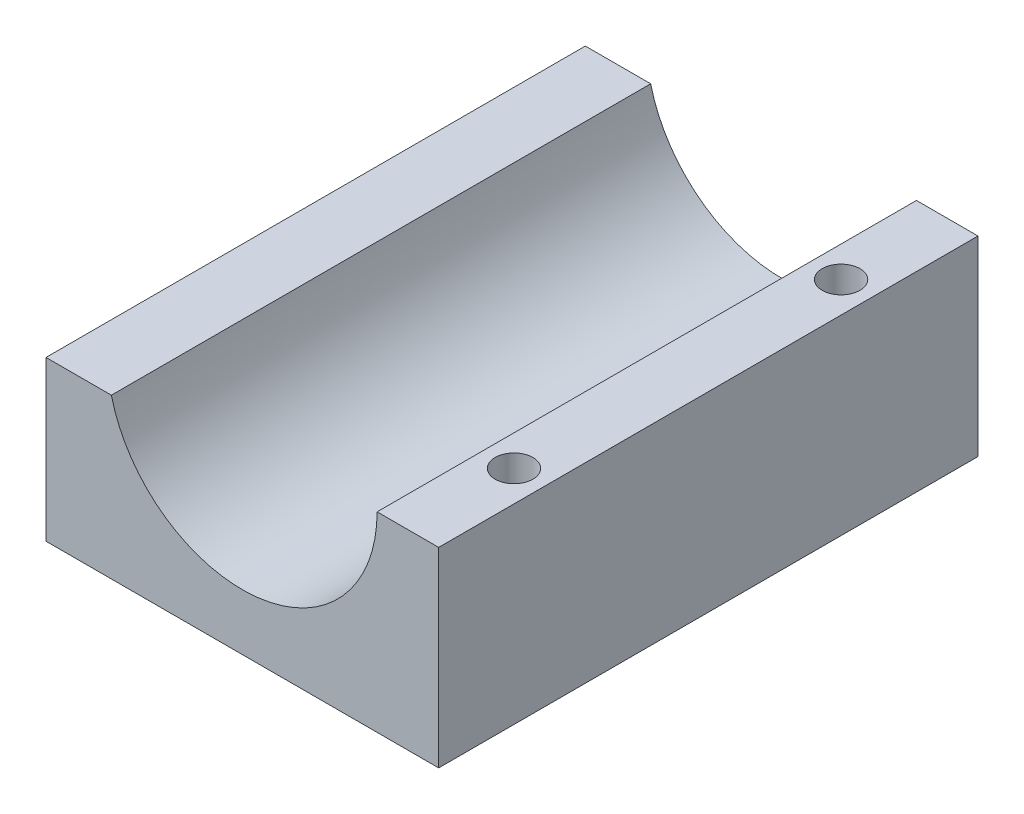
ISO-10303-21;
HEADER;
FILE_DESCRIPTION(('STEP AP214'),'2;1');
FILE_NAME('part.step','',(''),(''),'','','');
FILE_SCHEMA(('AUTOMOTIVE_DESIGN { 1 0 10303 214 1 1 1 1 }'));
ENDSEC;
DATA;
#1=APPLICATION_CONTEXT('core data for automotive mechanical design processes');
#2=APPLICATION_PROTOCOL_DEFINITION('international standard','automotive_design',2000,#1);
#3=PRODUCT_CONTEXT('',#1,'mechanical');
#4=PRODUCT('Part','Part','',(#3));
#5=PRODUCT_RELATED_PRODUCT_CATEGORY('part','',(#4));
#6=PRODUCT_DEFINITION_FORMATION('','',#4);
#7=PRODUCT_DEFINITION_CONTEXT('part definition',#1,'design');
#8=PRODUCT_DEFINITION('design','',#6,#7);
#9=PRODUCT_DEFINITION_SHAPE('','',#8);
#10=(LENGTH_UNIT() NAMED_UNIT(*) SI_UNIT(.MILLI.,.METRE.));
#11=(NAMED_UNIT(*) PLANE_ANGLE_UNIT() SI_UNIT($,.RADIAN.));
#12=(NAMED_UNIT(*) SI_UNIT($,.STERADIAN.) SOLID_ANGLE_UNIT());
#13=UNCERTAINTY_MEASURE_WITH_UNIT(LENGTH_MEASURE(1.E-05),#10,'distance_accuracy_value','');
#14=(GEOMETRIC_REPRESENTATION_CONTEXT(3) GLOBAL_UNCERTAINTY_ASSIGNED_CONTEXT((#13)) GLOBAL_UNIT_ASSIGNED_CONTEXT((#10,
#11,#12)) REPRESENTATION_CONTEXT('',''));
#15=CARTESIAN_POINT('',(0.,0.,0.));
#16=DIRECTION('',(0.,0.,1.));
#17=DIRECTION('',(1.,0.,0.));
#18=AXIS2_PLACEMENT_3D('',#15,#16,#17);
#19=CARTESIAN_POINT('',(0.,9.,0.));
#20=DIRECTION('',(1.,0.,0.));
#21=DIRECTION('',(0.,0.,-1.));
#22=AXIS2_PLACEMENT_3D('',#19,#20,#21);
#23=PLANE('',#22);
#24=DIRECTION('',(0.,0.,1.));
#25=VECTOR('',#24,1.);
#26=CARTESIAN_POINT('',(0.,7.5,-66.2778912014065));
#27=LINE('',#26,#25);
#28=CARTESIAN_POINT('',(0.,7.5,-25.41));
#29=VERTEX_POINT('',#28);
#30=CARTESIAN_POINT('',(0.,7.5,0.));
#31=VERTEX_POINT('',#30);
#32=EDGE_CURVE('E90',#29,#31,#27,.T.);
#33=ORIENTED_EDGE('',*,*,#32,.F.);
#34=DIRECTION('',(0.,-1.,0.));
#35=VECTOR('',#34,1.);
#36=CARTESIAN_POINT('',(0.,9.,-25.41));
#37=LINE('',#36,#35);
#38=CARTESIAN_POINT('',(0.,0.,-25.41));
#39=VERTEX_POINT('',#38);
#40=EDGE_CURVE('E84',#29,#39,#37,.T.);
#41=ORIENTED_EDGE('',*,*,#40,.T.);
#42=DIRECTION('',(0.,0.,1.));
#43=VECTOR('',#42,1.);
#44=CARTESIAN_POINT('',(0.,0.,0.));
#45=LINE('',#44,#43);
#46=CARTESIAN_POINT('',(0.,0.,0.));
#47=VERTEX_POINT('',#46);
#48=EDGE_CURVE('E88',#39,#47,#45,.T.);
#49=ORIENTED_EDGE('',*,*,#48,.T.);
#50=DIRECTION('',(0.,-1.,0.));
#51=VECTOR('',#50,1.);
#52=CARTESIAN_POINT('',(0.,9.,0.));
#53=LINE('',#52,#51);
#54=EDGE_CURVE('E49',#31,#47,#53,.T.);
#55=ORIENTED_EDGE('',*,*,#54,.F.);
#56=EDGE_LOOP('',(#33,#41,#49,#55));
#57=FACE_BOUND('',#56,.T.);
#58=ADVANCED_FACE('F42',(#57),#23,.F.);
#59=CARTESIAN_POINT('',(0.,9.,-25.41));
#60=DIRECTION('',(0.,0.,1.));
#61=DIRECTION('',(1.,0.,0.));
#62=AXIS2_PLACEMENT_3D('',#59,#60,#61);
#63=PLANE('',#62);
#64=DIRECTION('',(-1.,0.,0.));
#65=VECTOR('',#64,1.);
#66=CARTESIAN_POINT('',(0.,7.5,-25.41));
#67=LINE('',#66,#65);
#68=CARTESIAN_POINT('',(3.07970827269893,7.5,-25.41));
#69=VERTEX_POINT('',#68);
#70=EDGE_CURVE('E184',#69,#29,#67,.T.);
#71=ORIENTED_EDGE('',*,*,#70,.F.);
#72=CARTESIAN_POINT('',(9.25,9.,-25.41));
#73=DIRECTION('',(0.,0.,1.));
#74=DIRECTION('',(1.,0.,0.));
#75=AXIS2_PLACEMENT_3D('',#72,#73,#74);
#76=CIRCLE('',#75,6.35);
#77=CARTESIAN_POINT('',(15.6,9.,-25.41));
#78=VERTEX_POINT('',#77);
#79=EDGE_CURVE('E113',#69,#78,#76,.T.);
#80=ORIENTED_EDGE('',*,*,#79,.T.);
#81=DIRECTION('',(-1.,0.,0.));
#82=VECTOR('',#81,1.);
#83=CARTESIAN_POINT('',(0.,9.,-25.41));
#84=LINE('',#83,#82);
#85=CARTESIAN_POINT('',(18.5,9.,-25.41));
#86=VERTEX_POINT('',#85);
#87=EDGE_CURVE('E94',#86,#78,#84,.T.);
#88=ORIENTED_EDGE('',*,*,#87,.F.);
#89=DIRECTION('',(0.,-1.,0.));
#90=VECTOR('',#89,1.);
#91=CARTESIAN_POINT('',(18.5,9.,-25.41));
#92=LINE('',#91,#90);
#93=CARTESIAN_POINT('',(18.5,0.,-25.41));
#94=VERTEX_POINT('',#93);
#95=EDGE_CURVE('E93',#86,#94,#92,.T.);
#96=ORIENTED_EDGE('',*,*,#95,.T.);
#97=DIRECTION('',(-1.,0.,0.));
#98=VECTOR('',#97,1.);
#99=CARTESIAN_POINT('',(0.,0.,-25.41));
#100=LINE('',#99,#98);
#101=EDGE_CURVE('E98',#94,#39,#100,.T.);
#102=ORIENTED_EDGE('',*,*,#101,.T.);
#103=ORIENTED_EDGE('',*,*,#40,.F.);
#104=EDGE_LOOP('',(#71,#80,#88,#96,#102,#103));
#105=FACE_BOUND('',#104,.T.);
#106=ADVANCED_FACE('F99',(#105),#63,.F.);
#107=CARTESIAN_POINT('',(0.,9.,0.));
#108=DIRECTION('',(0.,-1.,0.));
#109=DIRECTION('',(0.,0.,-1.));
#110=AXIS2_PLACEMENT_3D('',#107,#108,#109);
#111=PLANE('',#110);
#112=CARTESIAN_POINT('',(17.05,9.,-20.41));
#113=DIRECTION('',(0.,1.,0.));
#114=DIRECTION('',(0.,0.,1.));
#115=AXIS2_PLACEMENT_3D('',#112,#113,#114);
#116=CIRCLE('',#115,0.88899999999999);
#117=CARTESIAN_POINT('',(17.05,9.,-19.521));
#118=VERTEX_POINT('',#117);
#119=EDGE_CURVE('E180',#118,#118,#116,.T.);
#120=ORIENTED_EDGE('',*,*,#119,.F.);
#121=EDGE_LOOP('',(#120));
#122=FACE_BOUND('',#121,.T.);
#123=CARTESIAN_POINT('',(17.05,9.,-5.));
#124=DIRECTION('',(0.,1.,0.));
#125=DIRECTION('',(0.,0.,1.));
#126=AXIS2_PLACEMENT_3D('',#123,#124,#125);
#127=CIRCLE('',#126,0.88899999999999);
#128=CARTESIAN_POINT('',(17.05,9.,-4.11100000000001));
#129=VERTEX_POINT('',#128);
#130=EDGE_CURVE('E174',#129,#129,#127,.T.);
#131=ORIENTED_EDGE('',*,*,#130,.F.);
#132=EDGE_LOOP('',(#131));
#133=FACE_BOUND('',#132,.T.);
#134=ORIENTED_EDGE('',*,*,#87,.T.);
#135=DIRECTION('',(0.,0.,1.));
#136=VECTOR('',#135,1.);
#137=CARTESIAN_POINT('',(15.6,9.,-25.41));
#138=LINE('',#137,#136);
#139=CARTESIAN_POINT('',(15.6,9.,0.));
#140=VERTEX_POINT('',#139);
#141=EDGE_CURVE('E109',#78,#140,#138,.T.);
#142=ORIENTED_EDGE('',*,*,#141,.T.);
#143=DIRECTION('',(1.,0.,0.));
#144=VECTOR('',#143,1.);
#145=CARTESIAN_POINT('',(0.,9.,0.));
#146=LINE('',#145,#144);
#147=CARTESIAN_POINT('',(18.5,9.,0.));
#148=VERTEX_POINT('',#147);
#149=EDGE_CURVE('E103',#140,#148,#146,.T.);
#150=ORIENTED_EDGE('',*,*,#149,.T.);
#151=DIRECTION('',(0.,0.,-1.));
#152=VECTOR('',#151,1.);
#153=CARTESIAN_POINT('',(18.5,9.,0.));
#154=LINE('',#153,#152);
#155=EDGE_CURVE('E64',#148,#86,#154,.T.);
#156=ORIENTED_EDGE('',*,*,#155,.T.);
#157=EDGE_LOOP('',(#134,#142,#150,#156));
#158=FACE_BOUND('',#157,.T.);
#159=ADVANCED_FACE('F156',(#122,#133,#158),#111,.F.);
#160=CARTESIAN_POINT('',(0.,9.,0.));
#161=DIRECTION('',(0.,0.,-1.));
#162=DIRECTION('',(-1.,0.,0.));
#163=AXIS2_PLACEMENT_3D('',#160,#161,#162);
#164=PLANE('',#163);
#165=CARTESIAN_POINT('',(9.25,9.,0.));
#166=DIRECTION('',(0.,0.,1.));
#167=DIRECTION('',(1.,0.,0.));
#168=AXIS2_PLACEMENT_3D('',#165,#166,#167);
#169=CIRCLE('',#168,6.35);
#170=CARTESIAN_POINT('',(3.07970827269893,7.5,0.));
#171=VERTEX_POINT('',#170);
#172=EDGE_CURVE('E150',#171,#140,#169,.T.);
#173=ORIENTED_EDGE('',*,*,#172,.F.);
#174=DIRECTION('',(-1.,0.,0.));
#175=VECTOR('',#174,1.);
#176=CARTESIAN_POINT('',(0.,7.5,0.));
#177=LINE('',#176,#175);
#178=EDGE_CURVE('E56',#171,#31,#177,.T.);
#179=ORIENTED_EDGE('',*,*,#178,.T.);
#180=ORIENTED_EDGE('',*,*,#54,.T.);
#181=DIRECTION('',(1.,0.,0.));
#182=VECTOR('',#181,1.);
#183=CARTESIAN_POINT('',(0.,0.,0.));
#184=LINE('',#183,#182);
#185=CARTESIAN_POINT('',(18.5,0.,0.));
#186=VERTEX_POINT('',#185);
#187=EDGE_CURVE('E108',#47,#186,#184,.T.);
#188=ORIENTED_EDGE('',*,*,#187,.T.);
#189=DIRECTION('',(0.,-1.,0.));
#190=VECTOR('',#189,1.);
#191=CARTESIAN_POINT('',(18.5,9.,0.));
#192=LINE('',#191,#190);
#193=EDGE_CURVE('E120',#148,#186,#192,.T.);
#194=ORIENTED_EDGE('',*,*,#193,.F.);
#195=ORIENTED_EDGE('',*,*,#149,.F.);
#196=EDGE_LOOP('',(#173,#179,#180,#188,#194,#195));
#197=FACE_BOUND('',#196,.T.);
#198=ADVANCED_FACE('F124',(#197),#164,.F.);
#199=CARTESIAN_POINT('',(18.5,9.,0.));
#200=DIRECTION('',(-1.,0.,0.));
#201=DIRECTION('',(0.,0.,1.));
#202=AXIS2_PLACEMENT_3D('',#199,#200,#201);
#203=PLANE('',#202);
#204=DIRECTION('',(0.,0.,-1.));
#205=VECTOR('',#204,1.);
#206=CARTESIAN_POINT('',(18.5,0.,0.));
#207=LINE('',#206,#205);
#208=EDGE_CURVE('E104',#186,#94,#207,.T.);
#209=ORIENTED_EDGE('',*,*,#208,.T.);
#210=ORIENTED_EDGE('',*,*,#95,.F.);
#211=ORIENTED_EDGE('',*,*,#155,.F.);
#212=ORIENTED_EDGE('',*,*,#193,.T.);
#213=EDGE_LOOP('',(#209,#210,#211,#212));
#214=FACE_BOUND('',#213,.T.);
#215=ADVANCED_FACE('F208',(#214),#203,.F.);
#216=CARTESIAN_POINT('',(0.,0.,0.));
#217=DIRECTION('',(0.,-1.,0.));
#218=DIRECTION('',(0.,0.,-1.));
#219=AXIS2_PLACEMENT_3D('',#216,#217,#218);
#220=PLANE('',#219);
#221=CARTESIAN_POINT('',(9.25,0.,-20.41));
#222=DIRECTION('',(0.,-1.,0.));
#223=DIRECTION('',(0.,0.,-1.));
#224=AXIS2_PLACEMENT_3D('',#221,#222,#223);
#225=CIRCLE('',#224,0.888999999999989);
#226=CARTESIAN_POINT('',(9.25,0.,-21.299));
#227=VERTEX_POINT('',#226);
#228=EDGE_CURVE('E168',#227,#227,#225,.T.);
#229=ORIENTED_EDGE('',*,*,#228,.F.);
#230=EDGE_LOOP('',(#229));
#231=FACE_BOUND('',#230,.T.);
#232=CARTESIAN_POINT('',(9.25,0.,-5.));
#233=DIRECTION('',(0.,-1.,0.));
#234=DIRECTION('',(0.,0.,-1.));
#235=AXIS2_PLACEMENT_3D('',#232,#233,#234);
#236=CIRCLE('',#235,0.888999999999989);
#237=CARTESIAN_POINT('',(9.25,0.,-5.88899999999999));
#238=VERTEX_POINT('',#237);
#239=EDGE_CURVE('E162',#238,#238,#236,.T.);
#240=ORIENTED_EDGE('',*,*,#239,.F.);
#241=EDGE_LOOP('',(#240));
#242=FACE_BOUND('',#241,.T.);
#243=ORIENTED_EDGE('',*,*,#48,.F.);
#244=ORIENTED_EDGE('',*,*,#101,.F.);
#245=ORIENTED_EDGE('',*,*,#208,.F.);
#246=ORIENTED_EDGE('',*,*,#187,.F.);
#247=EDGE_LOOP('',(#243,#244,#245,#246));
#248=FACE_BOUND('',#247,.T.);
#249=ADVANCED_FACE('F107',(#231,#242,#248),#220,.T.);
#250=CARTESIAN_POINT('',(9.25,9.,-25.41));
#251=DIRECTION('',(0.,0.,1.));
#252=DIRECTION('',(1.,0.,0.));
#253=AXIS2_PLACEMENT_3D('',#250,#251,#252);
#254=CYLINDRICAL_SURFACE('',#253,6.35);
#255=ORIENTED_EDGE('',*,*,#79,.F.);
#256=DIRECTION('',(0.,0.,1.));
#257=VECTOR('',#256,1.);
#258=CARTESIAN_POINT('',(3.07970827269893,7.5,-25.41));
#259=LINE('',#258,#257);
#260=EDGE_CURVE('E11',#69,#171,#259,.T.);
#261=ORIENTED_EDGE('',*,*,#260,.T.);
#262=ORIENTED_EDGE('',*,*,#172,.T.);
#263=ORIENTED_EDGE('',*,*,#141,.F.);
#264=EDGE_LOOP('',(#255,#261,#262,#263));
#265=FACE_BOUND('',#264,.T.);
#266=ADVANCED_FACE('F152',(#265),#254,.F.);
#267=CARTESIAN_POINT('',(9.25,1.9658349096845,-5.));
#268=DIRECTION('',(0.,-1.,0.));
#269=DIRECTION('',(0.,0.,-1.));
#270=AXIS2_PLACEMENT_3D('',#267,#268,#269);
#271=CONICAL_SURFACE('',#270,0.888999999999999,1.02974425867665);
#272=CARTESIAN_POINT('',(9.25,2.5,-5.));
#273=VERTEX_POINT('',#272);
#274=VERTEX_LOOP('',#273);
#275=FACE_BOUND('',#274,.T.);
#276=CARTESIAN_POINT('',(9.25,1.9658349096845,-5.));
#277=DIRECTION('',(0.,-1.,0.));
#278=DIRECTION('',(0.,0.,-1.));
#279=AXIS2_PLACEMENT_3D('',#276,#277,#278);
#280=CIRCLE('',#279,0.888999999999999);
#281=CARTESIAN_POINT('',(9.25,1.9658349096845,-5.889));
#282=VERTEX_POINT('',#281);
#283=EDGE_CURVE('E154',#282,#282,#280,.T.);
#284=ORIENTED_EDGE('',*,*,#283,.T.);
#285=EDGE_LOOP('',(#284));
#286=FACE_BOUND('',#285,.T.);
#287=ADVANCED_FACE('F235',(#275,#286),#271,.F.);
#288=CARTESIAN_POINT('',(9.25,0.,-5.));
#289=DIRECTION('',(0.,-1.,0.));
#290=DIRECTION('',(0.,0.,-1.));
#291=AXIS2_PLACEMENT_3D('',#288,#289,#290);
#292=CYLINDRICAL_SURFACE('',#291,0.888999999999994);
#293=ORIENTED_EDGE('',*,*,#283,.F.);
#294=EDGE_LOOP('',(#293));
#295=FACE_BOUND('',#294,.T.);
#296=ORIENTED_EDGE('',*,*,#239,.T.);
#297=EDGE_LOOP('',(#296));
#298=FACE_BOUND('',#297,.T.);
#299=ADVANCED_FACE('F242',(#295,#298),#292,.F.);
#300=CARTESIAN_POINT('',(9.25,1.9658349096845,-20.41));
#301=DIRECTION('',(0.,-1.,0.));
#302=DIRECTION('',(0.,0.,-1.));
#303=AXIS2_PLACEMENT_3D('',#300,#301,#302);
#304=CONICAL_SURFACE('',#303,0.888999999999999,1.02974425867665);
#305=CARTESIAN_POINT('',(9.25,2.5,-20.41));
#306=VERTEX_POINT('',#305);
#307=VERTEX_LOOP('',#306);
#308=FACE_BOUND('',#307,.T.);
#309=CARTESIAN_POINT('',(9.25,1.9658349096845,-20.41));
#310=DIRECTION('',(0.,-1.,0.));
#311=DIRECTION('',(0.,0.,-1.));
#312=AXIS2_PLACEMENT_3D('',#309,#310,#311);
#313=CIRCLE('',#312,0.888999999999999);
#314=CARTESIAN_POINT('',(9.25,1.9658349096845,-21.299));
#315=VERTEX_POINT('',#314);
#316=EDGE_CURVE('E165',#315,#315,#313,.T.);
#317=ORIENTED_EDGE('',*,*,#316,.T.);
#318=EDGE_LOOP('',(#317));
#319=FACE_BOUND('',#318,.T.);
#320=ADVANCED_FACE('F250',(#308,#319),#304,.F.);
#321=CARTESIAN_POINT('',(9.25,0.,-20.41));
#322=DIRECTION('',(0.,-1.,0.));
#323=DIRECTION('',(0.,0.,-1.));
#324=AXIS2_PLACEMENT_3D('',#321,#322,#323);
#325=CYLINDRICAL_SURFACE('',#324,0.888999999999994);
#326=ORIENTED_EDGE('',*,*,#316,.F.);
#327=EDGE_LOOP('',(#326));
#328=FACE_BOUND('',#327,.T.);
#329=ORIENTED_EDGE('',*,*,#228,.T.);
#330=EDGE_LOOP('',(#329));
#331=FACE_BOUND('',#330,.T.);
#332=ADVANCED_FACE('F259',(#328,#331),#325,.F.);
#333=CARTESIAN_POINT('',(17.05,5.5341650903155,-5.));
#334=DIRECTION('',(0.,1.,0.));
#335=DIRECTION('',(0.,0.,1.));
#336=AXIS2_PLACEMENT_3D('',#333,#334,#335);
#337=CONICAL_SURFACE('',#336,0.888999999999997,1.02974425867665);
#338=CARTESIAN_POINT('',(17.05,5.,-5.));
#339=VERTEX_POINT('',#338);
#340=VERTEX_LOOP('',#339);
#341=FACE_BOUND('',#340,.T.);
#342=CARTESIAN_POINT('',(17.05,5.5341650903155,-5.));
#343=DIRECTION('',(0.,1.,0.));
#344=DIRECTION('',(0.,0.,1.));
#345=AXIS2_PLACEMENT_3D('',#342,#343,#344);
#346=CIRCLE('',#345,0.888999999999997);
#347=CARTESIAN_POINT('',(17.05,5.5341650903155,-4.111));
#348=VERTEX_POINT('',#347);
#349=EDGE_CURVE('E171',#348,#348,#346,.T.);
#350=ORIENTED_EDGE('',*,*,#349,.T.);
#351=EDGE_LOOP('',(#350));
#352=FACE_BOUND('',#351,.T.);
#353=ADVANCED_FACE('F267',(#341,#352),#337,.F.);
#354=CARTESIAN_POINT('',(17.05,9.,-5.));
#355=DIRECTION('',(0.,1.,0.));
#356=DIRECTION('',(0.,0.,1.));
#357=AXIS2_PLACEMENT_3D('',#354,#355,#356);
#358=CYLINDRICAL_SURFACE('',#357,0.888999999999994);
#359=ORIENTED_EDGE('',*,*,#349,.F.);
#360=EDGE_LOOP('',(#359));
#361=FACE_BOUND('',#360,.T.);
#362=ORIENTED_EDGE('',*,*,#130,.T.);
#363=EDGE_LOOP('',(#362));
#364=FACE_BOUND('',#363,.T.);
#365=ADVANCED_FACE('F275',(#361,#364),#358,.F.);
#366=CARTESIAN_POINT('',(17.05,5.5341650903155,-20.41));
#367=DIRECTION('',(0.,1.,0.));
#368=DIRECTION('',(0.,0.,1.));
#369=AXIS2_PLACEMENT_3D('',#366,#367,#368);
#370=CONICAL_SURFACE('',#369,0.888999999999997,1.02974425867665);
#371=CARTESIAN_POINT('',(17.05,5.,-20.41));
#372=VERTEX_POINT('',#371);
#373=VERTEX_LOOP('',#372);
#374=FACE_BOUND('',#373,.T.);
#375=CARTESIAN_POINT('',(17.05,5.5341650903155,-20.41));
#376=DIRECTION('',(0.,1.,0.));
#377=DIRECTION('',(0.,0.,1.));
#378=AXIS2_PLACEMENT_3D('',#375,#376,#377);
#379=CIRCLE('',#378,0.888999999999997);
#380=CARTESIAN_POINT('',(17.05,5.5341650903155,-19.521));
#381=VERTEX_POINT('',#380);
#382=EDGE_CURVE('E177',#381,#381,#379,.T.);
#383=ORIENTED_EDGE('',*,*,#382,.T.);
#384=EDGE_LOOP('',(#383));
#385=FACE_BOUND('',#384,.T.);
#386=ADVANCED_FACE('F193',(#374,#385),#370,.F.);
#387=CARTESIAN_POINT('',(17.05,9.,-20.41));
#388=DIRECTION('',(0.,1.,0.));
#389=DIRECTION('',(0.,0.,1.));
#390=AXIS2_PLACEMENT_3D('',#387,#388,#389);
#391=CYLINDRICAL_SURFACE('',#390,0.888999999999994);
#392=ORIENTED_EDGE('',*,*,#382,.F.);
#393=EDGE_LOOP('',(#392));
#394=FACE_BOUND('',#393,.T.);
#395=ORIENTED_EDGE('',*,*,#119,.T.);
#396=EDGE_LOOP('',(#395));
#397=FACE_BOUND('',#396,.T.);
#398=ADVANCED_FACE('F188',(#394,#397),#391,.F.);
#399=CARTESIAN_POINT('',(0.,7.5,-66.2778912014065));
#400=DIRECTION('',(0.,-1.,0.));
#401=DIRECTION('',(0.,0.,-1.));
#402=AXIS2_PLACEMENT_3D('',#399,#400,#401);
#403=PLANE('',#402);
#404=ORIENTED_EDGE('',*,*,#260,.F.);
#405=ORIENTED_EDGE('',*,*,#70,.T.);
#406=ORIENTED_EDGE('',*,*,#32,.T.);
#407=ORIENTED_EDGE('',*,*,#178,.F.);
#408=EDGE_LOOP('',(#404,#405,#406,#407));
#409=FACE_BOUND('',#408,.T.);
#410=ADVANCED_FACE('F186',(#409),#403,.F.);
#411=CLOSED_SHELL('',(#58,#106,#159,#198,#215,#249,#266,#287,#299,#320,#332,#353,#365,#386,#398,#410));
#412=MANIFOLD_SOLID_BREP('B2',#411);
#413=ADVANCED_BREP_SHAPE_REPRESENTATION('',(#18,#412),#14);
#414=SHAPE_DEFINITION_REPRESENTATION(#9,#413);
ENDSEC;
END-ISO-10303-21;
